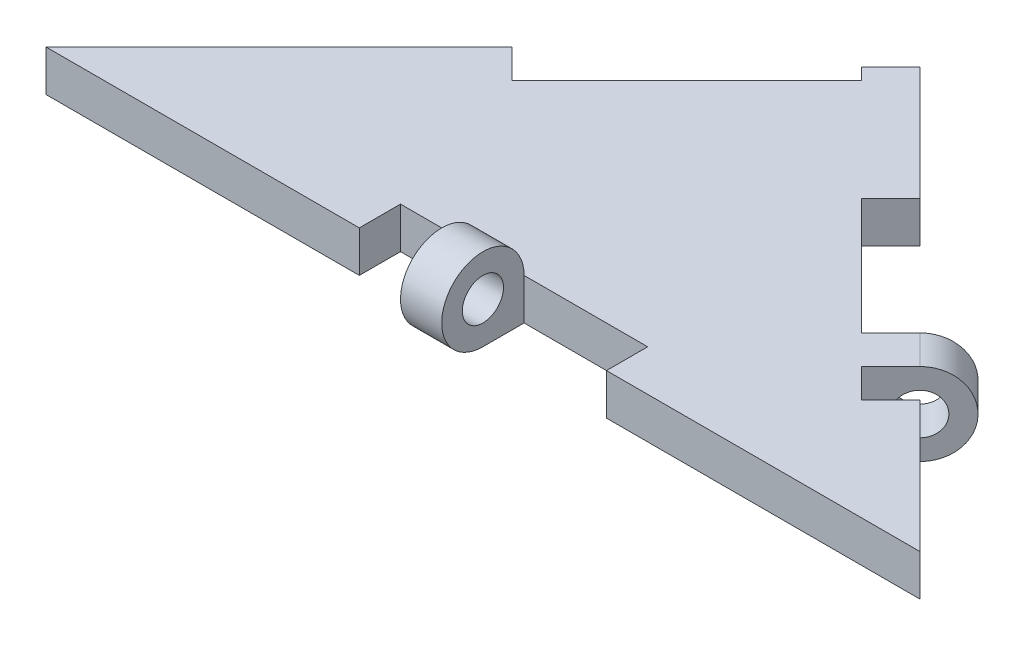
ISO-10303-21;
HEADER;
FILE_DESCRIPTION(('STEP AP214'),'2;1');
FILE_NAME('part.step','',(''),(''),'','','');
FILE_SCHEMA(('AUTOMOTIVE_DESIGN { 1 0 10303 214 1 1 1 1 }'));
ENDSEC;
DATA;
#1=APPLICATION_CONTEXT('core data for automotive mechanical design processes');
#2=APPLICATION_PROTOCOL_DEFINITION('international standard','automotive_design',2000,#1);
#3=PRODUCT_CONTEXT('',#1,'mechanical');
#4=PRODUCT('Part','Part','',(#3));
#5=PRODUCT_RELATED_PRODUCT_CATEGORY('part','',(#4));
#6=PRODUCT_DEFINITION_FORMATION('','',#4);
#7=PRODUCT_DEFINITION_CONTEXT('part definition',#1,'design');
#8=PRODUCT_DEFINITION('design','',#6,#7);
#9=PRODUCT_DEFINITION_SHAPE('','',#8);
#10=(LENGTH_UNIT() NAMED_UNIT(*) SI_UNIT(.MILLI.,.METRE.));
#11=(NAMED_UNIT(*) PLANE_ANGLE_UNIT() SI_UNIT($,.RADIAN.));
#12=(NAMED_UNIT(*) SI_UNIT($,.STERADIAN.) SOLID_ANGLE_UNIT());
#13=UNCERTAINTY_MEASURE_WITH_UNIT(LENGTH_MEASURE(1.E-05),#10,'distance_accuracy_value','');
#14=(GEOMETRIC_REPRESENTATION_CONTEXT(3) GLOBAL_UNCERTAINTY_ASSIGNED_CONTEXT((#13)) GLOBAL_UNIT_ASSIGNED_CONTEXT((#10,
#11,#12)) REPRESENTATION_CONTEXT('',''));
#15=CARTESIAN_POINT('',(0.,0.,0.));
#16=DIRECTION('',(0.,0.,1.));
#17=DIRECTION('',(1.,0.,0.));
#18=AXIS2_PLACEMENT_3D('',#15,#16,#17);
#19=CARTESIAN_POINT('',(12.3743686707646,5.,-33.587572106361));
#20=DIRECTION('',(-0.707106781186548,0.,0.707106781186547));
#21=DIRECTION('',(0.707106781186547,0.,0.707106781186548));
#22=AXIS2_PLACEMENT_3D('',#19,#20,#21);
#23=PLANE('',#22);
#24=DIRECTION('',(0.,1.,0.));
#25=VECTOR('',#24,1.);
#26=CARTESIAN_POINT('',(30.0520382004284,0.,-15.9099025766972));
#27=LINE('',#26,#25);
#28=CARTESIAN_POINT('',(30.0520382004284,0.,-15.9099025766972));
#29=VERTEX_POINT('',#28);
#30=CARTESIAN_POINT('',(30.0520382004283,5.,-15.9099025766972));
#31=VERTEX_POINT('',#30);
#32=EDGE_CURVE('E666',#29,#31,#27,.T.);
#33=ORIENTED_EDGE('',*,*,#32,.T.);
#34=DIRECTION('',(-0.707106781186547,0.,-0.707106781186548));
#35=VECTOR('',#34,1.);
#36=CARTESIAN_POINT('',(12.3743686707646,5.,-33.587572106361));
#37=LINE('',#36,#35);
#38=CARTESIAN_POINT('',(33.587572106361,5.,-12.3743686707646));
#39=VERTEX_POINT('',#38);
#40=EDGE_CURVE('E289',#39,#31,#37,.T.);
#41=ORIENTED_EDGE('',*,*,#40,.F.);
#42=DIRECTION('',(0.,-1.,0.));
#43=VECTOR('',#42,1.);
#44=CARTESIAN_POINT('',(33.587572106361,5.,-12.3743686707646));
#45=LINE('',#44,#43);
#46=CARTESIAN_POINT('',(33.587572106361,0.,-12.3743686707646));
#47=VERTEX_POINT('',#46);
#48=EDGE_CURVE('E300',#39,#47,#45,.T.);
#49=ORIENTED_EDGE('',*,*,#48,.T.);
#50=DIRECTION('',(-0.707106781186547,0.,-0.707106781186548));
#51=VECTOR('',#50,1.);
#52=CARTESIAN_POINT('',(12.3743686707646,0.,-33.587572106361));
#53=LINE('',#52,#51);
#54=EDGE_CURVE('E280',#47,#29,#53,.T.);
#55=ORIENTED_EDGE('',*,*,#54,.T.);
#56=EDGE_LOOP('',(#33,#41,#49,#55));
#57=FACE_BOUND('',#56,.T.);
#58=ADVANCED_FACE('F36',(#57),#23,.F.);
#59=CARTESIAN_POINT('',(-15.,0.,-5.00000000000001));
#60=DIRECTION('',(0.,0.,-1.));
#61=DIRECTION('',(-1.,0.,0.));
#62=AXIS2_PLACEMENT_3D('',#59,#60,#61);
#63=PLANE('',#62);
#64=DIRECTION('',(0.,-1.,0.));
#65=VECTOR('',#64,1.);
#66=CARTESIAN_POINT('',(0.,0.,-5.));
#67=LINE('',#66,#65);
#68=CARTESIAN_POINT('',(0.,5.,-5.));
#69=VERTEX_POINT('',#68);
#70=CARTESIAN_POINT('',(0.,0.,-5.00000000000001));
#71=VERTEX_POINT('',#70);
#72=EDGE_CURVE('E390',#69,#71,#67,.T.);
#73=ORIENTED_EDGE('',*,*,#72,.T.);
#74=DIRECTION('',(-1.,0.,0.));
#75=VECTOR('',#74,1.);
#76=CARTESIAN_POINT('',(-15.,0.,-5.00000000000001));
#77=LINE('',#76,#75);
#78=CARTESIAN_POINT('',(15.,0.,-5.00000000000001));
#79=VERTEX_POINT('',#78);
#80=EDGE_CURVE('E246',#79,#71,#77,.T.);
#81=ORIENTED_EDGE('',*,*,#80,.F.);
#82=DIRECTION('',(0.,1.,0.));
#83=VECTOR('',#82,1.);
#84=CARTESIAN_POINT('',(15.,0.,-5.00000000000001));
#85=LINE('',#84,#83);
#86=CARTESIAN_POINT('',(15.,5.,-5.00000000000001));
#87=VERTEX_POINT('',#86);
#88=EDGE_CURVE('E257',#79,#87,#85,.T.);
#89=ORIENTED_EDGE('',*,*,#88,.T.);
#90=DIRECTION('',(-1.,0.,0.));
#91=VECTOR('',#90,1.);
#92=CARTESIAN_POINT('',(-15.,5.,-5.00000000000001));
#93=LINE('',#92,#91);
#94=EDGE_CURVE('E237',#87,#69,#93,.T.);
#95=ORIENTED_EDGE('',*,*,#94,.T.);
#96=EDGE_LOOP('',(#73,#81,#89,#95));
#97=FACE_BOUND('',#96,.T.);
#98=ADVANCED_FACE('F341',(#97),#63,.F.);
#99=CARTESIAN_POINT('',(0.,5.,-53.0330085889911));
#100=DIRECTION('',(-0.707106781186548,0.,0.707106781186547));
#101=DIRECTION('',(0.707106781186547,0.,0.707106781186548));
#102=AXIS2_PLACEMENT_3D('',#99,#100,#101);
#103=PLANE('',#102);
#104=DIRECTION('',(-0.707106781186547,0.,-0.707106781186548));
#105=VECTOR('',#104,1.);
#106=CARTESIAN_POINT('',(0.,0.,-53.0330085889911));
#107=LINE('',#106,#105);
#108=CARTESIAN_POINT('',(15.9099025766973,0.,-37.1231060122937));
#109=VERTEX_POINT('',#108);
#110=CARTESIAN_POINT('',(2.12132034355963,0.,-50.9116882454314));
#111=VERTEX_POINT('',#110);
#112=EDGE_CURVE('E190',#109,#111,#107,.T.);
#113=ORIENTED_EDGE('',*,*,#112,.T.);
#114=DIRECTION('',(0.,-1.,0.));
#115=VECTOR('',#114,1.);
#116=CARTESIAN_POINT('',(2.12132034355963,10.,-50.9116882454314));
#117=LINE('',#116,#115);
#118=CARTESIAN_POINT('',(2.12132034355963,5.,-50.9116882454314));
#119=VERTEX_POINT('',#118);
#120=EDGE_CURVE('E176',#119,#111,#117,.T.);
#121=ORIENTED_EDGE('',*,*,#120,.F.);
#122=DIRECTION('',(-0.707106781186547,0.,-0.707106781186548));
#123=VECTOR('',#122,1.);
#124=CARTESIAN_POINT('',(0.,5.,-53.0330085889911));
#125=LINE('',#124,#123);
#126=CARTESIAN_POINT('',(15.9099025766973,5.,-37.1231060122937));
#127=VERTEX_POINT('',#126);
#128=EDGE_CURVE('E265',#127,#119,#125,.T.);
#129=ORIENTED_EDGE('',*,*,#128,.F.);
#130=DIRECTION('',(0.,-1.,0.));
#131=VECTOR('',#130,1.);
#132=CARTESIAN_POINT('',(15.9099025766973,5.,-37.1231060122937));
#133=LINE('',#132,#131);
#134=EDGE_CURVE('E197',#127,#109,#133,.T.);
#135=ORIENTED_EDGE('',*,*,#134,.T.);
#136=EDGE_LOOP('',(#113,#121,#129,#135));
#137=FACE_BOUND('',#136,.T.);
#138=ADVANCED_FACE('F196',(#137),#103,.F.);
#139=CARTESIAN_POINT('',(-53.0330085889911,5.,0.));
#140=DIRECTION('',(0.,0.,-1.));
#141=DIRECTION('',(-1.,0.,0.));
#142=AXIS2_PLACEMENT_3D('',#139,#140,#141);
#143=PLANE('',#142);
#144=DIRECTION('',(1.,0.,0.));
#145=VECTOR('',#144,1.);
#146=CARTESIAN_POINT('',(-53.0330085889911,0.,0.));
#147=LINE('',#146,#145);
#148=CARTESIAN_POINT('',(-53.0330085889911,0.,0.));
#149=VERTEX_POINT('',#148);
#150=CARTESIAN_POINT('',(-15.,0.,0.));
#151=VERTEX_POINT('',#150);
#152=EDGE_CURVE('E199',#149,#151,#147,.T.);
#153=ORIENTED_EDGE('',*,*,#152,.T.);
#154=DIRECTION('',(0.,1.,0.));
#155=VECTOR('',#154,1.);
#156=CARTESIAN_POINT('',(-15.,0.,0.));
#157=LINE('',#156,#155);
#158=CARTESIAN_POINT('',(-15.,5.,0.));
#159=VERTEX_POINT('',#158);
#160=EDGE_CURVE('E249',#151,#159,#157,.T.);
#161=ORIENTED_EDGE('',*,*,#160,.T.);
#162=DIRECTION('',(1.,0.,0.));
#163=VECTOR('',#162,1.);
#164=CARTESIAN_POINT('',(-53.0330085889911,5.,0.));
#165=LINE('',#164,#163);
#166=CARTESIAN_POINT('',(-53.0330085889911,5.,0.));
#167=VERTEX_POINT('',#166);
#168=EDGE_CURVE('E219',#167,#159,#165,.T.);
#169=ORIENTED_EDGE('',*,*,#168,.F.);
#170=DIRECTION('',(0.,-1.,0.));
#171=VECTOR('',#170,1.);
#172=CARTESIAN_POINT('',(-53.0330085889911,5.,0.));
#173=LINE('',#172,#171);
#174=EDGE_CURVE('E44',#167,#149,#173,.T.);
#175=ORIENTED_EDGE('',*,*,#174,.T.);
#176=EDGE_LOOP('',(#153,#161,#169,#175));
#177=FACE_BOUND('',#176,.T.);
#178=ADVANCED_FACE('F215',(#177),#143,.F.);
#179=CARTESIAN_POINT('',(-53.0330085889911,5.,0.));
#180=DIRECTION('',(0.707106781186548,0.,0.707106781186547));
#181=DIRECTION('',(0.707106781186547,0.,-0.707106781186548));
#182=AXIS2_PLACEMENT_3D('',#179,#180,#181);
#183=PLANE('',#182);
#184=DIRECTION('',(-0.707106781186547,0.,0.707106781186548));
#185=VECTOR('',#184,1.);
#186=CARTESIAN_POINT('',(-53.0330085889911,5.,0.));
#187=LINE('',#186,#185);
#188=CARTESIAN_POINT('',(-24.7487373415292,5.,-28.2842712474619));
#189=VERTEX_POINT('',#188);
#190=EDGE_CURVE('E202',#189,#167,#187,.T.);
#191=ORIENTED_EDGE('',*,*,#190,.F.);
#192=DIRECTION('',(0.,1.,0.));
#193=VECTOR('',#192,1.);
#194=CARTESIAN_POINT('',(-24.7487373415292,0.,-28.2842712474619));
#195=LINE('',#194,#193);
#196=CARTESIAN_POINT('',(-24.7487373415292,0.,-28.2842712474619));
#197=VERTEX_POINT('',#196);
#198=EDGE_CURVE('E225',#197,#189,#195,.T.);
#199=ORIENTED_EDGE('',*,*,#198,.F.);
#200=DIRECTION('',(-0.707106781186547,0.,0.707106781186548));
#201=VECTOR('',#200,1.);
#202=CARTESIAN_POINT('',(-53.0330085889911,0.,0.));
#203=LINE('',#202,#201);
#204=EDGE_CURVE('E224',#197,#149,#203,.T.);
#205=ORIENTED_EDGE('',*,*,#204,.T.);
#206=ORIENTED_EDGE('',*,*,#174,.F.);
#207=EDGE_LOOP('',(#191,#199,#205,#206));
#208=FACE_BOUND('',#207,.T.);
#209=ADVANCED_FACE('F38',(#208),#183,.F.);
#210=CARTESIAN_POINT('',(15.,5.,0.));
#211=VERTEX_POINT('',#210);
#212=CARTESIAN_POINT('',(53.0330085889911,5.,0.));
#213=VERTEX_POINT('',#212);
#214=EDGE_CURVE('E263',#211,#213,#165,.T.);
#215=ORIENTED_EDGE('',*,*,#214,.F.);
#216=DIRECTION('',(0.,1.,0.));
#217=VECTOR('',#216,1.);
#218=CARTESIAN_POINT('',(15.,0.,0.));
#219=LINE('',#218,#217);
#220=CARTESIAN_POINT('',(15.,0.,0.));
#221=VERTEX_POINT('',#220);
#222=EDGE_CURVE('E259',#221,#211,#219,.T.);
#223=ORIENTED_EDGE('',*,*,#222,.F.);
#224=CARTESIAN_POINT('',(53.0330085889911,0.,0.));
#225=VERTEX_POINT('',#224);
#226=EDGE_CURVE('E204',#221,#225,#147,.T.);
#227=ORIENTED_EDGE('',*,*,#226,.T.);
#228=DIRECTION('',(0.,-1.,0.));
#229=VECTOR('',#228,1.);
#230=CARTESIAN_POINT('',(53.0330085889911,5.,0.));
#231=LINE('',#230,#229);
#232=EDGE_CURVE('E208',#213,#225,#231,.T.);
#233=ORIENTED_EDGE('',*,*,#232,.F.);
#234=EDGE_LOOP('',(#215,#223,#227,#233));
#235=FACE_BOUND('',#234,.T.);
#236=ADVANCED_FACE('F534',(#235),#143,.F.);
#237=CARTESIAN_POINT('',(37.1231060122937,0.,-15.9099025766973));
#238=VERTEX_POINT('',#237);
#239=EDGE_CURVE('E198',#225,#238,#107,.T.);
#240=ORIENTED_EDGE('',*,*,#239,.T.);
#241=DIRECTION('',(0.,-1.,0.));
#242=VECTOR('',#241,1.);
#243=CARTESIAN_POINT('',(37.1231060122937,5.,-15.9099025766973));
#244=LINE('',#243,#242);
#245=CARTESIAN_POINT('',(37.1231060122937,5.,-15.9099025766973));
#246=VERTEX_POINT('',#245);
#247=EDGE_CURVE('E302',#246,#238,#244,.T.);
#248=ORIENTED_EDGE('',*,*,#247,.F.);
#249=EDGE_CURVE('E210',#213,#246,#125,.T.);
#250=ORIENTED_EDGE('',*,*,#249,.F.);
#251=ORIENTED_EDGE('',*,*,#232,.T.);
#252=EDGE_LOOP('',(#240,#248,#250,#251));
#253=FACE_BOUND('',#252,.T.);
#254=ADVANCED_FACE('F529',(#253),#103,.F.);
#255=CARTESIAN_POINT('',(0.,5.,0.));
#256=DIRECTION('',(0.,-1.,0.));
#257=DIRECTION('',(0.,0.,-1.));
#258=AXIS2_PLACEMENT_3D('',#255,#256,#257);
#259=PLANE('',#258);
#260=ORIENTED_EDGE('',*,*,#128,.T.);
#261=DIRECTION('',(-0.707106781186547,0.,0.707106781186548));
#262=VECTOR('',#261,1.);
#263=CARTESIAN_POINT('',(-24.3951839509359,5.,-24.3951839509359));
#264=LINE('',#263,#262);
#265=CARTESIAN_POINT('',(-1.41421356237312,5.,-47.3761543394987));
#266=VERTEX_POINT('',#265);
#267=EDGE_CURVE('E179',#119,#266,#264,.T.);
#268=ORIENTED_EDGE('',*,*,#267,.T.);
#269=DIRECTION('',(-0.707106781186546,0.,-0.707106781186549));
#270=VECTOR('',#269,1.);
#271=CARTESIAN_POINT('',(-3.53553390593274,5.,-49.4974746830583));
#272=LINE('',#271,#270);
#273=CARTESIAN_POINT('',(0.,5.,-45.9619407771256));
#274=VERTEX_POINT('',#273);
#275=EDGE_CURVE('E299',#274,#266,#272,.T.);
#276=ORIENTED_EDGE('',*,*,#275,.F.);
#277=DIRECTION('',(0.707106781186548,0.,-0.707106781186548));
#278=VECTOR('',#277,1.);
#279=CARTESIAN_POINT('',(0.,5.,-45.9619407771256));
#280=LINE('',#279,#278);
#281=CARTESIAN_POINT('',(-21.2132034355964,5.,-24.7487373415291));
#282=VERTEX_POINT('',#281);
#283=EDGE_CURVE('E307',#282,#274,#280,.T.);
#284=ORIENTED_EDGE('',*,*,#283,.F.);
#285=DIRECTION('',(0.707106781186549,0.,0.707106781186546));
#286=VECTOR('',#285,1.);
#287=CARTESIAN_POINT('',(-24.7487373415292,5.,-28.2842712474619));
#288=LINE('',#287,#286);
#289=EDGE_CURVE('E312',#189,#282,#288,.T.);
#290=ORIENTED_EDGE('',*,*,#289,.F.);
#291=ORIENTED_EDGE('',*,*,#190,.T.);
#292=ORIENTED_EDGE('',*,*,#168,.T.);
#293=DIRECTION('',(0.,0.,1.));
#294=VECTOR('',#293,1.);
#295=CARTESIAN_POINT('',(-15.,5.,0.));
#296=LINE('',#295,#294);
#297=CARTESIAN_POINT('',(-15.,5.,-5.00000000000001));
#298=VERTEX_POINT('',#297);
#299=EDGE_CURVE('E250',#298,#159,#296,.T.);
#300=ORIENTED_EDGE('',*,*,#299,.F.);
#301=CARTESIAN_POINT('',(-5.,5.,-5.00000000000001));
#302=VERTEX_POINT('',#301);
#303=EDGE_CURVE('E241',#302,#298,#93,.T.);
#304=ORIENTED_EDGE('',*,*,#303,.F.);
#305=DIRECTION('',(1.,0.,0.));
#306=VECTOR('',#305,1.);
#307=CARTESIAN_POINT('',(-5.,5.,-5.));
#308=LINE('',#307,#306);
#309=EDGE_CURVE('E286',#302,#69,#308,.T.);
#310=ORIENTED_EDGE('',*,*,#309,.T.);
#311=ORIENTED_EDGE('',*,*,#94,.F.);
#312=DIRECTION('',(0.,0.,-1.));
#313=VECTOR('',#312,1.);
#314=CARTESIAN_POINT('',(15.,5.,0.));
#315=LINE('',#314,#313);
#316=EDGE_CURVE('E252',#211,#87,#315,.T.);
#317=ORIENTED_EDGE('',*,*,#316,.F.);
#318=ORIENTED_EDGE('',*,*,#214,.T.);
#319=ORIENTED_EDGE('',*,*,#249,.T.);
#320=DIRECTION('',(-0.707106781186545,0.,0.70710678118655));
#321=VECTOR('',#320,1.);
#322=CARTESIAN_POINT('',(37.1231060122937,5.,-15.9099025766973));
#323=LINE('',#322,#321);
#324=EDGE_CURVE('E279',#246,#39,#323,.T.);
#325=ORIENTED_EDGE('',*,*,#324,.T.);
#326=ORIENTED_EDGE('',*,*,#40,.T.);
#327=DIRECTION('',(0.707106781186548,0.,-0.707106781186547));
#328=VECTOR('',#327,1.);
#329=CARTESIAN_POINT('',(7.07106781186554,5.,7.07106781186555));
#330=LINE('',#329,#328);
#331=CARTESIAN_POINT('',(33.5875721063611,5.,-19.44543648263));
#332=VERTEX_POINT('',#331);
#333=EDGE_CURVE('E668',#31,#332,#330,.T.);
#334=ORIENTED_EDGE('',*,*,#333,.T.);
#335=DIRECTION('',(0.707106781186547,0.,0.707106781186548));
#336=VECTOR('',#335,1.);
#337=CARTESIAN_POINT('',(30.0520382004284,5.,-22.9809703885627));
#338=LINE('',#337,#336);
#339=CARTESIAN_POINT('',(30.0520382004284,5.,-22.9809703885627));
#340=VERTEX_POINT('',#339);
#341=EDGE_CURVE('E387',#340,#332,#338,.T.);
#342=ORIENTED_EDGE('',*,*,#341,.F.);
#343=DIRECTION('',(0.707106781186548,0.,-0.707106781186547));
#344=VECTOR('',#343,1.);
#345=CARTESIAN_POINT('',(3.53553390593281,5.,3.53553390593281));
#346=LINE('',#345,#344);
#347=CARTESIAN_POINT('',(26.5165042944956,5.,-19.44543648263));
#348=VERTEX_POINT('',#347);
#349=EDGE_CURVE('E376',#348,#340,#346,.T.);
#350=ORIENTED_EDGE('',*,*,#349,.F.);
#351=CARTESIAN_POINT('',(12.3743686707646,5.,-33.587572106361));
#352=VERTEX_POINT('',#351);
#353=EDGE_CURVE('E58',#348,#352,#37,.T.);
#354=ORIENTED_EDGE('',*,*,#353,.T.);
#355=DIRECTION('',(0.70710678118655,0.,-0.707106781186545));
#356=VECTOR('',#355,1.);
#357=CARTESIAN_POINT('',(15.9099025766973,5.,-37.1231060122937));
#358=LINE('',#357,#356);
#359=EDGE_CURVE('E275',#352,#127,#358,.T.);
#360=ORIENTED_EDGE('',*,*,#359,.T.);
#361=EDGE_LOOP('',(#260,#268,#276,#284,#290,#291,#292,#300,#304,#310,#311,#317,#318,#319,#325,
#326,#334,#342,#350,#354,#360));
#362=FACE_BOUND('',#361,.T.);
#363=ADVANCED_FACE('F271',(#362),#259,.F.);
#364=CARTESIAN_POINT('',(0.,0.,0.));
#365=DIRECTION('',(0.,-1.,0.));
#366=DIRECTION('',(0.,0.,-1.));
#367=AXIS2_PLACEMENT_3D('',#364,#365,#366);
#368=PLANE('',#367);
#369=DIRECTION('',(-0.707106781186547,0.,0.707106781186548));
#370=VECTOR('',#369,1.);
#371=CARTESIAN_POINT('',(-19.032809535552,0.,-29.7575583663198));
#372=LINE('',#371,#370);
#373=CARTESIAN_POINT('',(-1.41421356237312,0.,-47.3761543394987));
#374=VERTEX_POINT('',#373);
#375=EDGE_CURVE('E51',#111,#374,#372,.T.);
#376=ORIENTED_EDGE('',*,*,#375,.F.);
#377=ORIENTED_EDGE('',*,*,#112,.F.);
#378=DIRECTION('',(0.70710678118655,0.,-0.707106781186545));
#379=VECTOR('',#378,1.);
#380=CARTESIAN_POINT('',(15.9099025766973,0.,-37.1231060122937));
#381=LINE('',#380,#379);
#382=CARTESIAN_POINT('',(12.3743686707646,0.,-33.587572106361));
#383=VERTEX_POINT('',#382);
#384=EDGE_CURVE('E292',#383,#109,#381,.T.);
#385=ORIENTED_EDGE('',*,*,#384,.F.);
#386=CARTESIAN_POINT('',(26.5165042944956,0.,-19.44543648263));
#387=VERTEX_POINT('',#386);
#388=EDGE_CURVE('E283',#387,#383,#53,.T.);
#389=ORIENTED_EDGE('',*,*,#388,.F.);
#390=DIRECTION('',(0.707106781186547,0.,0.707106781186548));
#391=VECTOR('',#390,1.);
#392=CARTESIAN_POINT('',(26.5165042944956,0.,-19.44543648263));
#393=LINE('',#392,#391);
#394=EDGE_CURVE('E369',#387,#29,#393,.T.);
#395=ORIENTED_EDGE('',*,*,#394,.T.);
#396=ORIENTED_EDGE('',*,*,#54,.F.);
#397=DIRECTION('',(-0.707106781186545,0.,0.70710678118655));
#398=VECTOR('',#397,1.);
#399=CARTESIAN_POINT('',(37.1231060122937,0.,-15.9099025766973));
#400=LINE('',#399,#398);
#401=EDGE_CURVE('E294',#238,#47,#400,.T.);
#402=ORIENTED_EDGE('',*,*,#401,.F.);
#403=ORIENTED_EDGE('',*,*,#239,.F.);
#404=ORIENTED_EDGE('',*,*,#226,.F.);
#405=DIRECTION('',(0.,0.,-1.));
#406=VECTOR('',#405,1.);
#407=CARTESIAN_POINT('',(15.,0.,0.));
#408=LINE('',#407,#406);
#409=EDGE_CURVE('E236',#221,#79,#408,.T.);
#410=ORIENTED_EDGE('',*,*,#409,.T.);
#411=ORIENTED_EDGE('',*,*,#80,.T.);
#412=DIRECTION('',(0.,0.,1.));
#413=VECTOR('',#412,1.);
#414=CARTESIAN_POINT('',(0.,0.,0.));
#415=LINE('',#414,#413);
#416=CARTESIAN_POINT('',(0.,0.,0.));
#417=VERTEX_POINT('',#416);
#418=EDGE_CURVE('E409',#71,#417,#415,.T.);
#419=ORIENTED_EDGE('',*,*,#418,.T.);
#420=DIRECTION('',(1.,0.,0.));
#421=VECTOR('',#420,1.);
#422=CARTESIAN_POINT('',(-5.,0.,0.));
#423=LINE('',#422,#421);
#424=CARTESIAN_POINT('',(-5.,0.,0.));
#425=VERTEX_POINT('',#424);
#426=EDGE_CURVE('E406',#425,#417,#423,.T.);
#427=ORIENTED_EDGE('',*,*,#426,.F.);
#428=DIRECTION('',(0.,0.,1.));
#429=VECTOR('',#428,1.);
#430=CARTESIAN_POINT('',(-5.,0.,0.));
#431=LINE('',#430,#429);
#432=CARTESIAN_POINT('',(-5.,0.,-5.00000000000001));
#433=VERTEX_POINT('',#432);
#434=EDGE_CURVE('E402',#433,#425,#431,.T.);
#435=ORIENTED_EDGE('',*,*,#434,.F.);
#436=CARTESIAN_POINT('',(-15.,0.,-5.00000000000001));
#437=VERTEX_POINT('',#436);
#438=EDGE_CURVE('E232',#433,#437,#77,.T.);
#439=ORIENTED_EDGE('',*,*,#438,.T.);
#440=DIRECTION('',(0.,0.,1.));
#441=VECTOR('',#440,1.);
#442=CARTESIAN_POINT('',(-15.,0.,0.));
#443=LINE('',#442,#441);
#444=EDGE_CURVE('E230',#437,#151,#443,.T.);
#445=ORIENTED_EDGE('',*,*,#444,.T.);
#446=ORIENTED_EDGE('',*,*,#152,.F.);
#447=ORIENTED_EDGE('',*,*,#204,.F.);
#448=DIRECTION('',(0.707106781186549,0.,0.707106781186546));
#449=VECTOR('',#448,1.);
#450=CARTESIAN_POINT('',(-24.7487373415292,0.,-28.2842712474619));
#451=LINE('',#450,#449);
#452=CARTESIAN_POINT('',(-21.2132034355964,0.,-24.7487373415291));
#453=VERTEX_POINT('',#452);
#454=EDGE_CURVE('E306',#197,#453,#451,.T.);
#455=ORIENTED_EDGE('',*,*,#454,.T.);
#456=DIRECTION('',(0.707106781186548,0.,-0.707106781186548));
#457=VECTOR('',#456,1.);
#458=CARTESIAN_POINT('',(0.,0.,-45.9619407771256));
#459=LINE('',#458,#457);
#460=CARTESIAN_POINT('',(0.,0.,-45.9619407771256));
#461=VERTEX_POINT('',#460);
#462=EDGE_CURVE('E309',#453,#461,#459,.T.);
#463=ORIENTED_EDGE('',*,*,#462,.T.);
#464=DIRECTION('',(-0.707106781186546,0.,-0.707106781186549));
#465=VECTOR('',#464,1.);
#466=CARTESIAN_POINT('',(-3.53553390593274,0.,-49.4974746830583));
#467=LINE('',#466,#465);
#468=EDGE_CURVE('E193',#461,#374,#467,.T.);
#469=ORIENTED_EDGE('',*,*,#468,.T.);
#470=EDGE_LOOP('',(#376,#377,#385,#389,#395,#396,#402,#403,#404,#410,#411,#419,#427,#435,#439,
#445,#446,#447,#455,#463,#469));
#471=FACE_BOUND('',#470,.T.);
#472=ADVANCED_FACE('F188',(#471),#368,.T.);
#473=CARTESIAN_POINT('',(-15.,0.,0.));
#474=DIRECTION('',(-1.,0.,0.));
#475=DIRECTION('',(0.,0.,1.));
#476=AXIS2_PLACEMENT_3D('',#473,#474,#475);
#477=PLANE('',#476);
#478=ORIENTED_EDGE('',*,*,#299,.T.);
#479=ORIENTED_EDGE('',*,*,#160,.F.);
#480=ORIENTED_EDGE('',*,*,#444,.F.);
#481=DIRECTION('',(0.,1.,0.));
#482=VECTOR('',#481,1.);
#483=CARTESIAN_POINT('',(-15.,0.,-5.00000000000001));
#484=LINE('',#483,#482);
#485=EDGE_CURVE('E227',#437,#298,#484,.T.);
#486=ORIENTED_EDGE('',*,*,#485,.T.);
#487=EDGE_LOOP('',(#478,#479,#480,#486));
#488=FACE_BOUND('',#487,.T.);
#489=ADVANCED_FACE('F502',(#488),#477,.F.);
#490=ORIENTED_EDGE('',*,*,#438,.F.);
#491=DIRECTION('',(0.,-1.,0.));
#492=VECTOR('',#491,1.);
#493=CARTESIAN_POINT('',(-5.,0.,-5.));
#494=LINE('',#493,#492);
#495=EDGE_CURVE('E398',#302,#433,#494,.T.);
#496=ORIENTED_EDGE('',*,*,#495,.F.);
#497=ORIENTED_EDGE('',*,*,#303,.T.);
#498=ORIENTED_EDGE('',*,*,#485,.F.);
#499=EDGE_LOOP('',(#490,#496,#497,#498));
#500=FACE_BOUND('',#499,.T.);
#501=ADVANCED_FACE('F335',(#500),#63,.F.);
#502=CARTESIAN_POINT('',(15.,0.,0.));
#503=DIRECTION('',(1.,0.,0.));
#504=DIRECTION('',(0.,0.,-1.));
#505=AXIS2_PLACEMENT_3D('',#502,#503,#504);
#506=PLANE('',#505);
#507=ORIENTED_EDGE('',*,*,#316,.T.);
#508=ORIENTED_EDGE('',*,*,#88,.F.);
#509=ORIENTED_EDGE('',*,*,#409,.F.);
#510=ORIENTED_EDGE('',*,*,#222,.T.);
#511=EDGE_LOOP('',(#507,#508,#509,#510));
#512=FACE_BOUND('',#511,.T.);
#513=ADVANCED_FACE('F328',(#512),#506,.F.);
#514=CARTESIAN_POINT('',(-3.53553390593274,0.,-49.4974746830583));
#515=DIRECTION('',(0.707106781186549,0.,-0.707106781186546));
#516=DIRECTION('',(-0.707106781186546,0.,-0.707106781186549));
#517=AXIS2_PLACEMENT_3D('',#514,#515,#516);
#518=PLANE('',#517);
#519=ORIENTED_EDGE('',*,*,#275,.T.);
#520=DIRECTION('',(0.,-1.,0.));
#521=VECTOR('',#520,1.);
#522=CARTESIAN_POINT('',(-1.41421356237312,0.,-47.3761543394987));
#523=LINE('',#522,#521);
#524=EDGE_CURVE('E11',#266,#374,#523,.T.);
#525=ORIENTED_EDGE('',*,*,#524,.T.);
#526=ORIENTED_EDGE('',*,*,#468,.F.);
#527=DIRECTION('',(0.,1.,0.));
#528=VECTOR('',#527,1.);
#529=CARTESIAN_POINT('',(0.,0.,-45.9619407771256));
#530=LINE('',#529,#528);
#531=EDGE_CURVE('E253',#461,#274,#530,.T.);
#532=ORIENTED_EDGE('',*,*,#531,.T.);
#533=EDGE_LOOP('',(#519,#525,#526,#532));
#534=FACE_BOUND('',#533,.T.);
#535=ADVANCED_FACE('F326',(#534),#518,.F.);
#536=CARTESIAN_POINT('',(0.,0.,-45.9619407771256));
#537=DIRECTION('',(0.707106781186548,0.,0.707106781186548));
#538=DIRECTION('',(0.707106781186548,0.,-0.707106781186548));
#539=AXIS2_PLACEMENT_3D('',#536,#537,#538);
#540=PLANE('',#539);
#541=ORIENTED_EDGE('',*,*,#283,.T.);
#542=ORIENTED_EDGE('',*,*,#531,.F.);
#543=ORIENTED_EDGE('',*,*,#462,.F.);
#544=DIRECTION('',(0.,1.,0.));
#545=VECTOR('',#544,1.);
#546=CARTESIAN_POINT('',(-21.2132034355964,0.,-24.7487373415291));
#547=LINE('',#546,#545);
#548=EDGE_CURVE('E317',#453,#282,#547,.T.);
#549=ORIENTED_EDGE('',*,*,#548,.T.);
#550=EDGE_LOOP('',(#541,#542,#543,#549));
#551=FACE_BOUND('',#550,.T.);
#552=ADVANCED_FACE('F324',(#551),#540,.F.);
#553=CARTESIAN_POINT('',(-24.7487373415292,0.,-28.2842712474619));
#554=DIRECTION('',(-0.707106781186546,0.,0.707106781186549));
#555=DIRECTION('',(0.707106781186549,0.,0.707106781186546));
#556=AXIS2_PLACEMENT_3D('',#553,#554,#555);
#557=PLANE('',#556);
#558=ORIENTED_EDGE('',*,*,#289,.T.);
#559=ORIENTED_EDGE('',*,*,#548,.F.);
#560=ORIENTED_EDGE('',*,*,#454,.F.);
#561=ORIENTED_EDGE('',*,*,#198,.T.);
#562=EDGE_LOOP('',(#558,#559,#560,#561));
#563=FACE_BOUND('',#562,.T.);
#564=ADVANCED_FACE('F322',(#563),#557,.F.);
#565=CARTESIAN_POINT('',(15.9099025766973,5.,-37.1231060122937));
#566=DIRECTION('',(-0.707106781186545,0.,-0.70710678118655));
#567=DIRECTION('',(-0.70710678118655,0.,0.707106781186545));
#568=AXIS2_PLACEMENT_3D('',#565,#566,#567);
#569=PLANE('',#568);
#570=ORIENTED_EDGE('',*,*,#384,.T.);
#571=ORIENTED_EDGE('',*,*,#134,.F.);
#572=ORIENTED_EDGE('',*,*,#359,.F.);
#573=DIRECTION('',(0.,-1.,0.));
#574=VECTOR('',#573,1.);
#575=CARTESIAN_POINT('',(12.3743686707646,5.,-33.587572106361));
#576=LINE('',#575,#574);
#577=EDGE_CURVE('E297',#352,#383,#576,.T.);
#578=ORIENTED_EDGE('',*,*,#577,.T.);
#579=EDGE_LOOP('',(#570,#571,#572,#578));
#580=FACE_BOUND('',#579,.T.);
#581=ADVANCED_FACE('F353',(#580),#569,.F.);
#582=ORIENTED_EDGE('',*,*,#353,.F.);
#583=DIRECTION('',(0.,1.,0.));
#584=VECTOR('',#583,1.);
#585=CARTESIAN_POINT('',(26.5165042944956,0.,-19.44543648263));
#586=LINE('',#585,#584);
#587=EDGE_CURVE('E375',#387,#348,#586,.T.);
#588=ORIENTED_EDGE('',*,*,#587,.F.);
#589=ORIENTED_EDGE('',*,*,#388,.T.);
#590=ORIENTED_EDGE('',*,*,#577,.F.);
#591=EDGE_LOOP('',(#582,#588,#589,#590));
#592=FACE_BOUND('',#591,.T.);
#593=ADVANCED_FACE('F344',(#592),#23,.F.);
#594=CARTESIAN_POINT('',(37.1231060122937,5.,-15.9099025766973));
#595=DIRECTION('',(0.70710678118655,0.,0.707106781186545));
#596=DIRECTION('',(0.707106781186545,0.,-0.70710678118655));
#597=AXIS2_PLACEMENT_3D('',#594,#595,#596);
#598=PLANE('',#597);
#599=ORIENTED_EDGE('',*,*,#401,.T.);
#600=ORIENTED_EDGE('',*,*,#48,.F.);
#601=ORIENTED_EDGE('',*,*,#324,.F.);
#602=ORIENTED_EDGE('',*,*,#247,.T.);
#603=EDGE_LOOP('',(#599,#600,#601,#602));
#604=FACE_BOUND('',#603,.T.);
#605=ADVANCED_FACE('F352',(#604),#598,.F.);
#606=CARTESIAN_POINT('',(-5.,5.,0.));
#607=DIRECTION('',(1.,0.,0.));
#608=DIRECTION('',(0.,0.,-1.));
#609=AXIS2_PLACEMENT_3D('',#606,#607,#608);
#610=CYLINDRICAL_SURFACE('',#609,5.);
#611=CARTESIAN_POINT('',(0.,5.,0.));
#612=DIRECTION('',(-1.,0.,0.));
#613=DIRECTION('',(0.,0.,1.));
#614=AXIS2_PLACEMENT_3D('',#611,#612,#613);
#615=CIRCLE('',#614,5.);
#616=EDGE_CURVE('E386',#417,#69,#615,.T.);
#617=ORIENTED_EDGE('',*,*,#616,.T.);
#618=ORIENTED_EDGE('',*,*,#309,.F.);
#619=CARTESIAN_POINT('',(-5.,5.,0.));
#620=DIRECTION('',(-1.,0.,0.));
#621=DIRECTION('',(0.,0.,1.));
#622=AXIS2_PLACEMENT_3D('',#619,#620,#621);
#623=CIRCLE('',#622,5.);
#624=EDGE_CURVE('E395',#425,#302,#623,.T.);
#625=ORIENTED_EDGE('',*,*,#624,.F.);
#626=ORIENTED_EDGE('',*,*,#426,.T.);
#627=EDGE_LOOP('',(#617,#618,#625,#626));
#628=FACE_BOUND('',#627,.T.);
#629=ADVANCED_FACE('F358',(#628),#610,.T.);
#630=CARTESIAN_POINT('',(-5.,5.,0.));
#631=DIRECTION('',(1.,0.,0.));
#632=DIRECTION('',(0.,0.,-1.));
#633=AXIS2_PLACEMENT_3D('',#630,#631,#632);
#634=CYLINDRICAL_SURFACE('',#633,2.5);
#635=CARTESIAN_POINT('',(-5.,5.,0.));
#636=DIRECTION('',(-1.,0.,0.));
#637=DIRECTION('',(0.,0.,1.));
#638=AXIS2_PLACEMENT_3D('',#635,#636,#637);
#639=CIRCLE('',#638,2.5);
#640=CARTESIAN_POINT('',(-5.,5.,2.5));
#641=VERTEX_POINT('',#640);
#642=EDGE_CURVE('E404',#641,#641,#639,.T.);
#643=ORIENTED_EDGE('',*,*,#642,.T.);
#644=EDGE_LOOP('',(#643));
#645=FACE_BOUND('',#644,.T.);
#646=CARTESIAN_POINT('',(0.,5.,0.));
#647=DIRECTION('',(-1.,0.,0.));
#648=DIRECTION('',(0.,0.,1.));
#649=AXIS2_PLACEMENT_3D('',#646,#647,#648);
#650=CIRCLE('',#649,2.5);
#651=CARTESIAN_POINT('',(0.,5.,2.5));
#652=VERTEX_POINT('',#651);
#653=EDGE_CURVE('E399',#652,#652,#650,.T.);
#654=ORIENTED_EDGE('',*,*,#653,.F.);
#655=EDGE_LOOP('',(#654));
#656=FACE_BOUND('',#655,.T.);
#657=ADVANCED_FACE('F429',(#645,#656),#634,.F.);
#658=CARTESIAN_POINT('',(-5.,0.,0.));
#659=DIRECTION('',(-1.,0.,0.));
#660=DIRECTION('',(0.,0.,1.));
#661=AXIS2_PLACEMENT_3D('',#658,#659,#660);
#662=PLANE('',#661);
#663=ORIENTED_EDGE('',*,*,#624,.T.);
#664=ORIENTED_EDGE('',*,*,#495,.T.);
#665=ORIENTED_EDGE('',*,*,#434,.T.);
#666=EDGE_LOOP('',(#663,#664,#665));
#667=FACE_BOUND('',#666,.T.);
#668=ORIENTED_EDGE('',*,*,#642,.F.);
#669=EDGE_LOOP('',(#668));
#670=FACE_BOUND('',#669,.T.);
#671=ADVANCED_FACE('F433',(#667,#670),#662,.T.);
#672=CARTESIAN_POINT('',(0.,0.,0.));
#673=DIRECTION('',(-1.,0.,0.));
#674=DIRECTION('',(0.,0.,1.));
#675=AXIS2_PLACEMENT_3D('',#672,#673,#674);
#676=PLANE('',#675);
#677=ORIENTED_EDGE('',*,*,#616,.F.);
#678=ORIENTED_EDGE('',*,*,#418,.F.);
#679=ORIENTED_EDGE('',*,*,#72,.F.);
#680=EDGE_LOOP('',(#677,#678,#679));
#681=FACE_BOUND('',#680,.T.);
#682=ORIENTED_EDGE('',*,*,#653,.T.);
#683=EDGE_LOOP('',(#682));
#684=FACE_BOUND('',#683,.T.);
#685=ADVANCED_FACE('F426',(#681,#684),#676,.F.);
#686=CARTESIAN_POINT('',(30.0520382004284,0.,-22.9809703885628));
#687=DIRECTION('',(0.707106781186547,0.,0.707106781186548));
#688=DIRECTION('',(0.707106781186548,0.,-0.707106781186547));
#689=AXIS2_PLACEMENT_3D('',#686,#687,#688);
#690=CYLINDRICAL_SURFACE('',#689,5.);
#691=CARTESIAN_POINT('',(33.5875721063611,0.,-19.44543648263));
#692=DIRECTION('',(-0.707106781186547,0.,-0.707106781186548));
#693=DIRECTION('',(-0.707106781186548,0.,0.707106781186547));
#694=AXIS2_PLACEMENT_3D('',#691,#692,#693);
#695=CIRCLE('',#694,5.);
#696=EDGE_CURVE('E385',#332,#29,#695,.T.);
#697=ORIENTED_EDGE('',*,*,#696,.T.);
#698=ORIENTED_EDGE('',*,*,#394,.F.);
#699=CARTESIAN_POINT('',(30.0520382004284,0.,-22.9809703885628));
#700=DIRECTION('',(-0.707106781186547,0.,-0.707106781186548));
#701=DIRECTION('',(-0.707106781186548,0.,0.707106781186547));
#702=AXIS2_PLACEMENT_3D('',#699,#700,#701);
#703=CIRCLE('',#702,5.);
#704=EDGE_CURVE('E373',#340,#387,#703,.T.);
#705=ORIENTED_EDGE('',*,*,#704,.F.);
#706=ORIENTED_EDGE('',*,*,#341,.T.);
#707=EDGE_LOOP('',(#697,#698,#705,#706));
#708=FACE_BOUND('',#707,.T.);
#709=ADVANCED_FACE('F383',(#708),#690,.T.);
#710=CARTESIAN_POINT('',(30.0520382004284,0.,-22.9809703885628));
#711=DIRECTION('',(0.707106781186547,0.,0.707106781186548));
#712=DIRECTION('',(0.707106781186548,0.,-0.707106781186547));
#713=AXIS2_PLACEMENT_3D('',#710,#711,#712);
#714=CYLINDRICAL_SURFACE('',#713,2.5);
#715=CARTESIAN_POINT('',(30.0520382004284,0.,-22.9809703885628));
#716=DIRECTION('',(-0.707106781186547,0.,-0.707106781186548));
#717=DIRECTION('',(-0.707106781186548,0.,0.707106781186547));
#718=AXIS2_PLACEMENT_3D('',#715,#716,#717);
#719=CIRCLE('',#718,2.5);
#720=CARTESIAN_POINT('',(28.284271247462,0.,-21.2132034355964));
#721=VERTEX_POINT('',#720);
#722=EDGE_CURVE('E380',#721,#721,#719,.T.);
#723=ORIENTED_EDGE('',*,*,#722,.T.);
#724=EDGE_LOOP('',(#723));
#725=FACE_BOUND('',#724,.T.);
#726=CARTESIAN_POINT('',(33.5875721063611,0.,-19.44543648263));
#727=DIRECTION('',(-0.707106781186547,0.,-0.707106781186548));
#728=DIRECTION('',(-0.707106781186548,0.,0.707106781186547));
#729=AXIS2_PLACEMENT_3D('',#726,#727,#728);
#730=CIRCLE('',#729,2.5);
#731=CARTESIAN_POINT('',(31.8198051533948,0.,-17.6776695296636));
#732=VERTEX_POINT('',#731);
#733=EDGE_CURVE('E675',#732,#732,#730,.T.);
#734=ORIENTED_EDGE('',*,*,#733,.F.);
#735=EDGE_LOOP('',(#734));
#736=FACE_BOUND('',#735,.T.);
#737=ADVANCED_FACE('F442',(#725,#736),#714,.F.);
#738=CARTESIAN_POINT('',(3.53553390593281,0.,3.53553390593282));
#739=DIRECTION('',(-0.707106781186547,0.,-0.707106781186548));
#740=DIRECTION('',(-0.707106781186548,0.,0.707106781186547));
#741=AXIS2_PLACEMENT_3D('',#738,#739,#740);
#742=PLANE('',#741);
#743=ORIENTED_EDGE('',*,*,#722,.F.);
#744=EDGE_LOOP('',(#743));
#745=FACE_BOUND('',#744,.T.);
#746=ORIENTED_EDGE('',*,*,#704,.T.);
#747=ORIENTED_EDGE('',*,*,#587,.T.);
#748=ORIENTED_EDGE('',*,*,#349,.T.);
#749=EDGE_LOOP('',(#746,#747,#748));
#750=FACE_BOUND('',#749,.T.);
#751=ADVANCED_FACE('F374',(#745,#750),#742,.T.);
#752=CARTESIAN_POINT('',(7.07106781186554,0.,7.07106781186555));
#753=DIRECTION('',(-0.707106781186547,0.,-0.707106781186548));
#754=DIRECTION('',(-0.707106781186548,0.,0.707106781186547));
#755=AXIS2_PLACEMENT_3D('',#752,#753,#754);
#756=PLANE('',#755);
#757=ORIENTED_EDGE('',*,*,#733,.T.);
#758=EDGE_LOOP('',(#757));
#759=FACE_BOUND('',#758,.T.);
#760=ORIENTED_EDGE('',*,*,#696,.F.);
#761=ORIENTED_EDGE('',*,*,#333,.F.);
#762=ORIENTED_EDGE('',*,*,#32,.F.);
#763=EDGE_LOOP('',(#760,#761,#762));
#764=FACE_BOUND('',#763,.T.);
#765=ADVANCED_FACE('F448',(#759,#764),#756,.F.);
#766=CARTESIAN_POINT('',(-19.032809535552,10.,-29.7575583663198));
#767=DIRECTION('',(0.707106781186548,0.,0.707106781186547));
#768=DIRECTION('',(0.707106781186547,0.,-0.707106781186548));
#769=AXIS2_PLACEMENT_3D('',#766,#767,#768);
#770=PLANE('',#769);
#771=ORIENTED_EDGE('',*,*,#120,.T.);
#772=ORIENTED_EDGE('',*,*,#375,.T.);
#773=ORIENTED_EDGE('',*,*,#524,.F.);
#774=ORIENTED_EDGE('',*,*,#267,.F.);
#775=EDGE_LOOP('',(#771,#772,#773,#774));
#776=FACE_BOUND('',#775,.T.);
#777=ADVANCED_FACE('F177',(#776),#770,.F.);
#778=CLOSED_SHELL('',(#58,#98,#138,#178,#209,#236,#254,#363,#472,#489,#501,#513,#535,#552,#564,
#581,#593,#605,#629,#657,#671,#685,#709,#737,#751,#765,#777));
#779=MANIFOLD_SOLID_BREP('B2',#778);
#780=ADVANCED_BREP_SHAPE_REPRESENTATION('',(#18,#779),#14);
#781=SHAPE_DEFINITION_REPRESENTATION(#9,#780);
ENDSEC;
END-ISO-10303-21;
